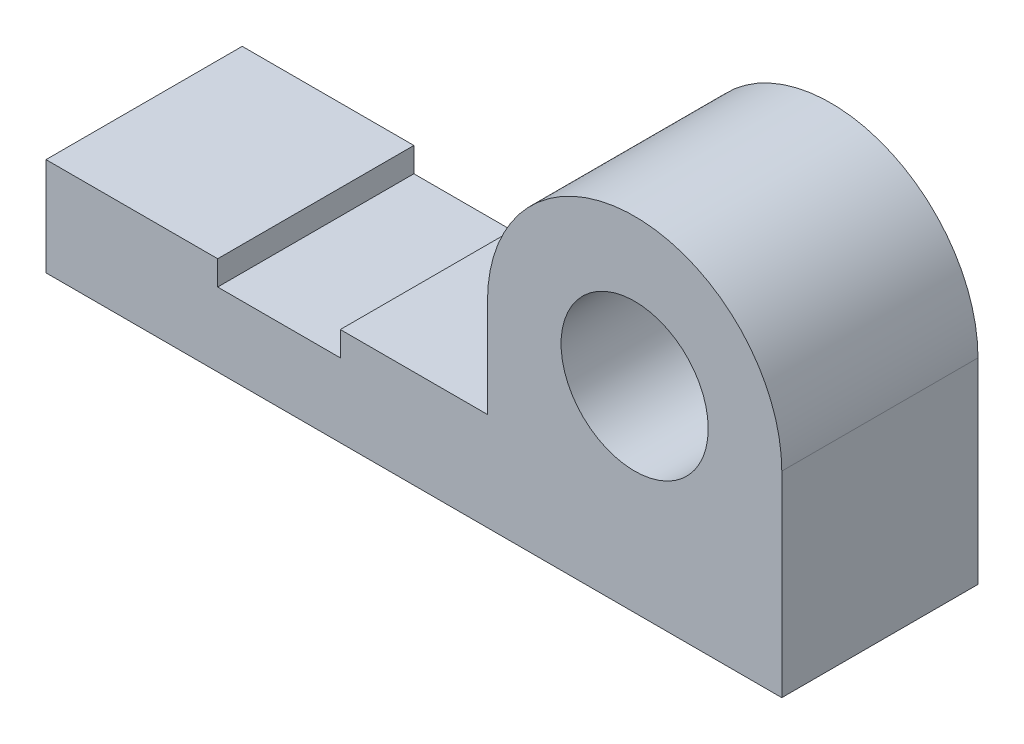
ISO-10303-21;
HEADER;
FILE_DESCRIPTION(('STEP AP214'),'2;1');
FILE_NAME('part.step','',(''),(''),'','','');
FILE_SCHEMA(('AUTOMOTIVE_DESIGN { 1 0 10303 214 1 1 1 1 }'));
ENDSEC;
DATA;
#1=APPLICATION_CONTEXT('core data for automotive mechanical design processes');
#2=APPLICATION_PROTOCOL_DEFINITION('international standard','automotive_design',2000,#1);
#3=PRODUCT_CONTEXT('',#1,'mechanical');
#4=PRODUCT('Part','Part','',(#3));
#5=PRODUCT_RELATED_PRODUCT_CATEGORY('part','',(#4));
#6=PRODUCT_DEFINITION_FORMATION('','',#4);
#7=PRODUCT_DEFINITION_CONTEXT('part definition',#1,'design');
#8=PRODUCT_DEFINITION('design','',#6,#7);
#9=PRODUCT_DEFINITION_SHAPE('','',#8);
#10=(LENGTH_UNIT() NAMED_UNIT(*) SI_UNIT(.MILLI.,.METRE.));
#11=(NAMED_UNIT(*) PLANE_ANGLE_UNIT() SI_UNIT($,.RADIAN.));
#12=(NAMED_UNIT(*) SI_UNIT($,.STERADIAN.) SOLID_ANGLE_UNIT());
#13=UNCERTAINTY_MEASURE_WITH_UNIT(LENGTH_MEASURE(1.E-05),#10,'distance_accuracy_value','');
#14=(GEOMETRIC_REPRESENTATION_CONTEXT(3) GLOBAL_UNCERTAINTY_ASSIGNED_CONTEXT((#13)) GLOBAL_UNIT_ASSIGNED_CONTEXT((#10,
#11,#12)) REPRESENTATION_CONTEXT('',''));
#15=CARTESIAN_POINT('',(0.,0.,0.));
#16=DIRECTION('',(0.,0.,1.));
#17=DIRECTION('',(1.,0.,0.));
#18=AXIS2_PLACEMENT_3D('',#15,#16,#17);
#19=CARTESIAN_POINT('',(-30.,40.,20.));
#20=DIRECTION('',(0.,0.,-1.));
#21=DIRECTION('',(-1.,0.,0.));
#22=AXIS2_PLACEMENT_3D('',#19,#20,#21);
#23=PLANE('',#22);
#24=DIRECTION('',(0.,1.,0.));
#25=VECTOR('',#24,1.);
#26=CARTESIAN_POINT('',(0.,40.,20.));
#27=LINE('',#26,#25);
#28=CARTESIAN_POINT('',(0.,0.,20.));
#29=VERTEX_POINT('',#28);
#30=CARTESIAN_POINT('',(0.,40.,20.));
#31=VERTEX_POINT('',#30);
#32=EDGE_CURVE('E167',#29,#31,#27,.T.);
#33=ORIENTED_EDGE('',*,*,#32,.T.);
#34=CARTESIAN_POINT('',(-30.,40.,20.));
#35=DIRECTION('',(0.,0.,1.));
#36=DIRECTION('',(-1.,0.,0.));
#37=AXIS2_PLACEMENT_3D('',#34,#35,#36);
#38=CIRCLE('',#37,30.);
#39=CARTESIAN_POINT('',(-60.,40.,20.));
#40=VERTEX_POINT('',#39);
#41=EDGE_CURVE('E103',#31,#40,#38,.T.);
#42=ORIENTED_EDGE('',*,*,#41,.T.);
#43=DIRECTION('',(0.,-1.,0.));
#44=VECTOR('',#43,1.);
#45=CARTESIAN_POINT('',(-60.,20.,20.));
#46=LINE('',#45,#44);
#47=CARTESIAN_POINT('',(-60.,20.,20.));
#48=VERTEX_POINT('',#47);
#49=EDGE_CURVE('E187',#40,#48,#46,.T.);
#50=ORIENTED_EDGE('',*,*,#49,.T.);
#51=DIRECTION('',(-1.,0.,0.));
#52=VECTOR('',#51,1.);
#53=CARTESIAN_POINT('',(-90.,20.,20.));
#54=LINE('',#53,#52);
#55=CARTESIAN_POINT('',(-90.,20.,20.));
#56=VERTEX_POINT('',#55);
#57=EDGE_CURVE('E207',#48,#56,#54,.T.);
#58=ORIENTED_EDGE('',*,*,#57,.T.);
#59=DIRECTION('',(0.,-1.,0.));
#60=VECTOR('',#59,1.);
#61=CARTESIAN_POINT('',(-90.,15.,20.));
#62=LINE('',#61,#60);
#63=CARTESIAN_POINT('',(-90.,15.,20.));
#64=VERTEX_POINT('',#63);
#65=EDGE_CURVE('E204',#56,#64,#62,.T.);
#66=ORIENTED_EDGE('',*,*,#65,.T.);
#67=DIRECTION('',(-1.,0.,0.));
#68=VECTOR('',#67,1.);
#69=CARTESIAN_POINT('',(-115.,15.,20.));
#70=LINE('',#69,#68);
#71=CARTESIAN_POINT('',(-115.,15.,20.));
#72=VERTEX_POINT('',#71);
#73=EDGE_CURVE('E206',#64,#72,#70,.T.);
#74=ORIENTED_EDGE('',*,*,#73,.T.);
#75=DIRECTION('',(0.,1.,0.));
#76=VECTOR('',#75,1.);
#77=CARTESIAN_POINT('',(-115.,20.,20.));
#78=LINE('',#77,#76);
#79=CARTESIAN_POINT('',(-115.,20.,20.));
#80=VERTEX_POINT('',#79);
#81=EDGE_CURVE('E127',#72,#80,#78,.T.);
#82=ORIENTED_EDGE('',*,*,#81,.T.);
#83=DIRECTION('',(-1.,0.,0.));
#84=VECTOR('',#83,1.);
#85=CARTESIAN_POINT('',(-150.,20.,20.));
#86=LINE('',#85,#84);
#87=CARTESIAN_POINT('',(-150.,20.,20.));
#88=VERTEX_POINT('',#87);
#89=EDGE_CURVE('E125',#80,#88,#86,.T.);
#90=ORIENTED_EDGE('',*,*,#89,.T.);
#91=DIRECTION('',(0.,-1.,0.));
#92=VECTOR('',#91,1.);
#93=CARTESIAN_POINT('',(-150.,0.,20.));
#94=LINE('',#93,#92);
#95=CARTESIAN_POINT('',(-150.,0.,20.));
#96=VERTEX_POINT('',#95);
#97=EDGE_CURVE('E126',#88,#96,#94,.T.);
#98=ORIENTED_EDGE('',*,*,#97,.T.);
#99=DIRECTION('',(1.,0.,0.));
#100=VECTOR('',#99,1.);
#101=CARTESIAN_POINT('',(0.,0.,20.));
#102=LINE('',#101,#100);
#103=EDGE_CURVE('E57',#96,#29,#102,.T.);
#104=ORIENTED_EDGE('',*,*,#103,.T.);
#105=EDGE_LOOP('',(#33,#42,#50,#58,#66,#74,#82,#90,#98,#104));
#106=FACE_BOUND('',#105,.T.);
#107=CARTESIAN_POINT('',(-30.,40.,20.));
#108=DIRECTION('',(0.,0.,1.));
#109=DIRECTION('',(1.,0.,0.));
#110=AXIS2_PLACEMENT_3D('',#107,#108,#109);
#111=CIRCLE('',#110,15.);
#112=CARTESIAN_POINT('',(-15.,40.,20.));
#113=VERTEX_POINT('',#112);
#114=EDGE_CURVE('E152',#113,#113,#111,.T.);
#115=ORIENTED_EDGE('',*,*,#114,.F.);
#116=EDGE_LOOP('',(#115));
#117=FACE_BOUND('',#116,.T.);
#118=ADVANCED_FACE('F39',(#106,#117),#23,.F.);
#119=CARTESIAN_POINT('',(-30.,40.,-20.));
#120=DIRECTION('',(0.,0.,-1.));
#121=DIRECTION('',(-1.,0.,0.));
#122=AXIS2_PLACEMENT_3D('',#119,#120,#121);
#123=PLANE('',#122);
#124=DIRECTION('',(0.,1.,0.));
#125=VECTOR('',#124,1.);
#126=CARTESIAN_POINT('',(0.,40.,-20.));
#127=LINE('',#126,#125);
#128=CARTESIAN_POINT('',(0.,0.,-20.));
#129=VERTEX_POINT('',#128);
#130=CARTESIAN_POINT('',(0.,40.,-20.));
#131=VERTEX_POINT('',#130);
#132=EDGE_CURVE('E149',#129,#131,#127,.T.);
#133=ORIENTED_EDGE('',*,*,#132,.F.);
#134=DIRECTION('',(1.,0.,0.));
#135=VECTOR('',#134,1.);
#136=CARTESIAN_POINT('',(0.,0.,-20.));
#137=LINE('',#136,#135);
#138=CARTESIAN_POINT('',(-150.,0.,-20.));
#139=VERTEX_POINT('',#138);
#140=EDGE_CURVE('E100',#139,#129,#137,.T.);
#141=ORIENTED_EDGE('',*,*,#140,.F.);
#142=DIRECTION('',(0.,-1.,0.));
#143=VECTOR('',#142,1.);
#144=CARTESIAN_POINT('',(-150.,0.,-20.));
#145=LINE('',#144,#143);
#146=CARTESIAN_POINT('',(-150.,20.,-20.));
#147=VERTEX_POINT('',#146);
#148=EDGE_CURVE('E91',#147,#139,#145,.T.);
#149=ORIENTED_EDGE('',*,*,#148,.F.);
#150=DIRECTION('',(-1.,0.,0.));
#151=VECTOR('',#150,1.);
#152=CARTESIAN_POINT('',(-150.,20.,-20.));
#153=LINE('',#152,#151);
#154=CARTESIAN_POINT('',(-115.,20.,-20.));
#155=VERTEX_POINT('',#154);
#156=EDGE_CURVE('E138',#155,#147,#153,.T.);
#157=ORIENTED_EDGE('',*,*,#156,.F.);
#158=DIRECTION('',(0.,1.,0.));
#159=VECTOR('',#158,1.);
#160=CARTESIAN_POINT('',(-115.,20.,-20.));
#161=LINE('',#160,#159);
#162=CARTESIAN_POINT('',(-115.,15.,-20.));
#163=VERTEX_POINT('',#162);
#164=EDGE_CURVE('E162',#163,#155,#161,.T.);
#165=ORIENTED_EDGE('',*,*,#164,.F.);
#166=DIRECTION('',(-1.,0.,0.));
#167=VECTOR('',#166,1.);
#168=CARTESIAN_POINT('',(-115.,15.,-20.));
#169=LINE('',#168,#167);
#170=CARTESIAN_POINT('',(-90.,15.,-20.));
#171=VERTEX_POINT('',#170);
#172=EDGE_CURVE('E158',#171,#163,#169,.T.);
#173=ORIENTED_EDGE('',*,*,#172,.F.);
#174=DIRECTION('',(0.,-1.,0.));
#175=VECTOR('',#174,1.);
#176=CARTESIAN_POINT('',(-90.,15.,-20.));
#177=LINE('',#176,#175);
#178=CARTESIAN_POINT('',(-90.,20.,-20.));
#179=VERTEX_POINT('',#178);
#180=EDGE_CURVE('E156',#179,#171,#177,.T.);
#181=ORIENTED_EDGE('',*,*,#180,.F.);
#182=DIRECTION('',(-1.,0.,0.));
#183=VECTOR('',#182,1.);
#184=CARTESIAN_POINT('',(-90.,20.,-20.));
#185=LINE('',#184,#183);
#186=CARTESIAN_POINT('',(-60.,20.,-20.));
#187=VERTEX_POINT('',#186);
#188=EDGE_CURVE('E157',#187,#179,#185,.T.);
#189=ORIENTED_EDGE('',*,*,#188,.F.);
#190=DIRECTION('',(0.,-1.,0.));
#191=VECTOR('',#190,1.);
#192=CARTESIAN_POINT('',(-60.,20.,-20.));
#193=LINE('',#192,#191);
#194=CARTESIAN_POINT('',(-60.,40.,-20.));
#195=VERTEX_POINT('',#194);
#196=EDGE_CURVE('E153',#195,#187,#193,.T.);
#197=ORIENTED_EDGE('',*,*,#196,.F.);
#198=CARTESIAN_POINT('',(-30.,40.,-20.));
#199=DIRECTION('',(0.,0.,1.));
#200=DIRECTION('',(-1.,0.,0.));
#201=AXIS2_PLACEMENT_3D('',#198,#199,#200);
#202=CIRCLE('',#201,30.);
#203=EDGE_CURVE('E151',#131,#195,#202,.T.);
#204=ORIENTED_EDGE('',*,*,#203,.F.);
#205=EDGE_LOOP('',(#133,#141,#149,#157,#165,#173,#181,#189,#197,#204));
#206=FACE_BOUND('',#205,.T.);
#207=CARTESIAN_POINT('',(-30.,40.,-20.));
#208=DIRECTION('',(0.,0.,1.));
#209=DIRECTION('',(1.,0.,0.));
#210=AXIS2_PLACEMENT_3D('',#207,#208,#209);
#211=CIRCLE('',#210,15.);
#212=CARTESIAN_POINT('',(-15.,40.,-20.));
#213=VERTEX_POINT('',#212);
#214=EDGE_CURVE('E214',#213,#213,#211,.T.);
#215=ORIENTED_EDGE('',*,*,#214,.T.);
#216=EDGE_LOOP('',(#215));
#217=FACE_BOUND('',#216,.T.);
#218=ADVANCED_FACE('F195',(#206,#217),#123,.T.);
#219=CARTESIAN_POINT('',(0.,40.,20.));
#220=DIRECTION('',(-1.,0.,0.));
#221=DIRECTION('',(0.,-1.,0.));
#222=AXIS2_PLACEMENT_3D('',#219,#220,#221);
#223=PLANE('',#222);
#224=ORIENTED_EDGE('',*,*,#132,.T.);
#225=DIRECTION('',(0.,0.,-1.));
#226=VECTOR('',#225,1.);
#227=CARTESIAN_POINT('',(0.,40.,20.));
#228=LINE('',#227,#226);
#229=EDGE_CURVE('E11',#31,#131,#228,.T.);
#230=ORIENTED_EDGE('',*,*,#229,.F.);
#231=ORIENTED_EDGE('',*,*,#32,.F.);
#232=DIRECTION('',(0.,0.,-1.));
#233=VECTOR('',#232,1.);
#234=CARTESIAN_POINT('',(0.,0.,20.));
#235=LINE('',#234,#233);
#236=EDGE_CURVE('E143',#29,#129,#235,.T.);
#237=ORIENTED_EDGE('',*,*,#236,.T.);
#238=EDGE_LOOP('',(#224,#230,#231,#237));
#239=FACE_BOUND('',#238,.T.);
#240=ADVANCED_FACE('F41',(#239),#223,.F.);
#241=CARTESIAN_POINT('',(-30.,40.,20.));
#242=DIRECTION('',(0.,0.,-1.));
#243=DIRECTION('',(-1.,0.,0.));
#244=AXIS2_PLACEMENT_3D('',#241,#242,#243);
#245=CYLINDRICAL_SURFACE('',#244,30.);
#246=ORIENTED_EDGE('',*,*,#203,.T.);
#247=DIRECTION('',(0.,0.,-1.));
#248=VECTOR('',#247,1.);
#249=CARTESIAN_POINT('',(-60.,40.,20.));
#250=LINE('',#249,#248);
#251=EDGE_CURVE('E48',#40,#195,#250,.T.);
#252=ORIENTED_EDGE('',*,*,#251,.F.);
#253=ORIENTED_EDGE('',*,*,#41,.F.);
#254=ORIENTED_EDGE('',*,*,#229,.T.);
#255=EDGE_LOOP('',(#246,#252,#253,#254));
#256=FACE_BOUND('',#255,.T.);
#257=ADVANCED_FACE('F251',(#256),#245,.T.);
#258=CARTESIAN_POINT('',(-60.,20.,20.));
#259=DIRECTION('',(1.,0.,0.));
#260=DIRECTION('',(0.,0.,-1.));
#261=AXIS2_PLACEMENT_3D('',#258,#259,#260);
#262=PLANE('',#261);
#263=ORIENTED_EDGE('',*,*,#196,.T.);
#264=DIRECTION('',(0.,0.,-1.));
#265=VECTOR('',#264,1.);
#266=CARTESIAN_POINT('',(-60.,20.,20.));
#267=LINE('',#266,#265);
#268=EDGE_CURVE('E179',#48,#187,#267,.T.);
#269=ORIENTED_EDGE('',*,*,#268,.F.);
#270=ORIENTED_EDGE('',*,*,#49,.F.);
#271=ORIENTED_EDGE('',*,*,#251,.T.);
#272=EDGE_LOOP('',(#263,#269,#270,#271));
#273=FACE_BOUND('',#272,.T.);
#274=ADVANCED_FACE('F186',(#273),#262,.F.);
#275=CARTESIAN_POINT('',(-90.,20.,20.));
#276=DIRECTION('',(0.,-1.,0.));
#277=DIRECTION('',(0.,0.,-1.));
#278=AXIS2_PLACEMENT_3D('',#275,#276,#277);
#279=PLANE('',#278);
#280=ORIENTED_EDGE('',*,*,#188,.T.);
#281=DIRECTION('',(0.,0.,-1.));
#282=VECTOR('',#281,1.);
#283=CARTESIAN_POINT('',(-90.,20.,20.));
#284=LINE('',#283,#282);
#285=EDGE_CURVE('E180',#56,#179,#284,.T.);
#286=ORIENTED_EDGE('',*,*,#285,.F.);
#287=ORIENTED_EDGE('',*,*,#57,.F.);
#288=ORIENTED_EDGE('',*,*,#268,.T.);
#289=EDGE_LOOP('',(#280,#286,#287,#288));
#290=FACE_BOUND('',#289,.T.);
#291=ADVANCED_FACE('F199',(#290),#279,.F.);
#292=CARTESIAN_POINT('',(-90.,15.,20.));
#293=DIRECTION('',(1.,0.,0.));
#294=DIRECTION('',(0.,0.,-1.));
#295=AXIS2_PLACEMENT_3D('',#292,#293,#294);
#296=PLANE('',#295);
#297=ORIENTED_EDGE('',*,*,#180,.T.);
#298=DIRECTION('',(0.,0.,-1.));
#299=VECTOR('',#298,1.);
#300=CARTESIAN_POINT('',(-90.,15.,20.));
#301=LINE('',#300,#299);
#302=EDGE_CURVE('E174',#64,#171,#301,.T.);
#303=ORIENTED_EDGE('',*,*,#302,.F.);
#304=ORIENTED_EDGE('',*,*,#65,.F.);
#305=ORIENTED_EDGE('',*,*,#285,.T.);
#306=EDGE_LOOP('',(#297,#303,#304,#305));
#307=FACE_BOUND('',#306,.T.);
#308=ADVANCED_FACE('F205',(#307),#296,.F.);
#309=CARTESIAN_POINT('',(-115.,15.,20.));
#310=DIRECTION('',(0.,-1.,0.));
#311=DIRECTION('',(0.,0.,-1.));
#312=AXIS2_PLACEMENT_3D('',#309,#310,#311);
#313=PLANE('',#312);
#314=ORIENTED_EDGE('',*,*,#172,.T.);
#315=DIRECTION('',(0.,0.,-1.));
#316=VECTOR('',#315,1.);
#317=CARTESIAN_POINT('',(-115.,15.,20.));
#318=LINE('',#317,#316);
#319=EDGE_CURVE('E173',#72,#163,#318,.T.);
#320=ORIENTED_EDGE('',*,*,#319,.F.);
#321=ORIENTED_EDGE('',*,*,#73,.F.);
#322=ORIENTED_EDGE('',*,*,#302,.T.);
#323=EDGE_LOOP('',(#314,#320,#321,#322));
#324=FACE_BOUND('',#323,.T.);
#325=ADVANCED_FACE('F241',(#324),#313,.F.);
#326=CARTESIAN_POINT('',(-115.,20.,20.));
#327=DIRECTION('',(-1.,0.,0.));
#328=DIRECTION('',(0.,0.,1.));
#329=AXIS2_PLACEMENT_3D('',#326,#327,#328);
#330=PLANE('',#329);
#331=ORIENTED_EDGE('',*,*,#164,.T.);
#332=DIRECTION('',(0.,0.,-1.));
#333=VECTOR('',#332,1.);
#334=CARTESIAN_POINT('',(-115.,20.,20.));
#335=LINE('',#334,#333);
#336=EDGE_CURVE('E137',#80,#155,#335,.T.);
#337=ORIENTED_EDGE('',*,*,#336,.F.);
#338=ORIENTED_EDGE('',*,*,#81,.F.);
#339=ORIENTED_EDGE('',*,*,#319,.T.);
#340=EDGE_LOOP('',(#331,#337,#338,#339));
#341=FACE_BOUND('',#340,.T.);
#342=ADVANCED_FACE('F239',(#341),#330,.F.);
#343=CARTESIAN_POINT('',(-150.,20.,20.));
#344=DIRECTION('',(0.,-1.,0.));
#345=DIRECTION('',(0.,0.,-1.));
#346=AXIS2_PLACEMENT_3D('',#343,#344,#345);
#347=PLANE('',#346);
#348=ORIENTED_EDGE('',*,*,#156,.T.);
#349=DIRECTION('',(0.,0.,-1.));
#350=VECTOR('',#349,1.);
#351=CARTESIAN_POINT('',(-150.,20.,20.));
#352=LINE('',#351,#350);
#353=EDGE_CURVE('E134',#88,#147,#352,.T.);
#354=ORIENTED_EDGE('',*,*,#353,.F.);
#355=ORIENTED_EDGE('',*,*,#89,.F.);
#356=ORIENTED_EDGE('',*,*,#336,.T.);
#357=EDGE_LOOP('',(#348,#354,#355,#356));
#358=FACE_BOUND('',#357,.T.);
#359=ADVANCED_FACE('F136',(#358),#347,.F.);
#360=CARTESIAN_POINT('',(-150.,0.,20.));
#361=DIRECTION('',(1.,0.,0.));
#362=DIRECTION('',(0.,0.,-1.));
#363=AXIS2_PLACEMENT_3D('',#360,#361,#362);
#364=PLANE('',#363);
#365=ORIENTED_EDGE('',*,*,#148,.T.);
#366=DIRECTION('',(0.,0.,-1.));
#367=VECTOR('',#366,1.);
#368=CARTESIAN_POINT('',(-150.,0.,20.));
#369=LINE('',#368,#367);
#370=EDGE_CURVE('E139',#96,#139,#369,.T.);
#371=ORIENTED_EDGE('',*,*,#370,.F.);
#372=ORIENTED_EDGE('',*,*,#97,.F.);
#373=ORIENTED_EDGE('',*,*,#353,.T.);
#374=EDGE_LOOP('',(#365,#371,#372,#373));
#375=FACE_BOUND('',#374,.T.);
#376=ADVANCED_FACE('F145',(#375),#364,.F.);
#377=CARTESIAN_POINT('',(0.,0.,20.));
#378=DIRECTION('',(0.,1.,0.));
#379=DIRECTION('',(0.,0.,1.));
#380=AXIS2_PLACEMENT_3D('',#377,#378,#379);
#381=PLANE('',#380);
#382=ORIENTED_EDGE('',*,*,#140,.T.);
#383=ORIENTED_EDGE('',*,*,#236,.F.);
#384=ORIENTED_EDGE('',*,*,#103,.F.);
#385=ORIENTED_EDGE('',*,*,#370,.T.);
#386=EDGE_LOOP('',(#382,#383,#384,#385));
#387=FACE_BOUND('',#386,.T.);
#388=ADVANCED_FACE('F231',(#387),#381,.F.);
#389=CARTESIAN_POINT('',(-30.,40.,20.));
#390=DIRECTION('',(0.,0.,-1.));
#391=DIRECTION('',(-1.,0.,0.));
#392=AXIS2_PLACEMENT_3D('',#389,#390,#391);
#393=CYLINDRICAL_SURFACE('',#392,15.);
#394=ORIENTED_EDGE('',*,*,#114,.T.);
#395=EDGE_LOOP('',(#394));
#396=FACE_BOUND('',#395,.T.);
#397=ORIENTED_EDGE('',*,*,#214,.F.);
#398=EDGE_LOOP('',(#397));
#399=FACE_BOUND('',#398,.T.);
#400=ADVANCED_FACE('F221',(#396,#399),#393,.F.);
#401=CLOSED_SHELL('',(#118,#218,#240,#257,#274,#291,#308,#325,#342,#359,#376,#388,#400));
#402=MANIFOLD_SOLID_BREP('B2',#401);
#403=ADVANCED_BREP_SHAPE_REPRESENTATION('',(#18,#402),#14);
#404=SHAPE_DEFINITION_REPRESENTATION(#9,#403);
ENDSEC;
END-ISO-10303-21;
